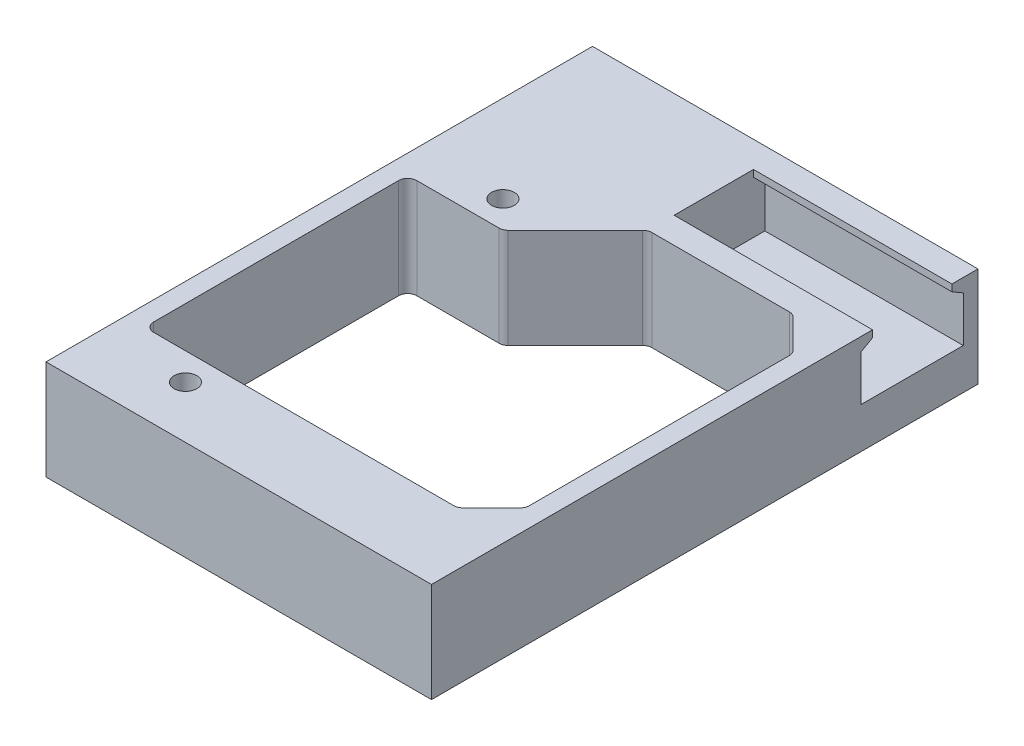
ISO-10303-21;
HEADER;
FILE_DESCRIPTION(('STEP AP214'),'2;1');
FILE_NAME('part.step','',(''),(''),'','','');
FILE_SCHEMA(('AUTOMOTIVE_DESIGN { 1 0 10303 214 1 1 1 1 }'));
ENDSEC;
DATA;
#1=APPLICATION_CONTEXT('core data for automotive mechanical design processes');
#2=APPLICATION_PROTOCOL_DEFINITION('international standard','automotive_design',2000,#1);
#3=PRODUCT_CONTEXT('',#1,'mechanical');
#4=PRODUCT('Part','Part','',(#3));
#5=PRODUCT_RELATED_PRODUCT_CATEGORY('part','',(#4));
#6=PRODUCT_DEFINITION_FORMATION('','',#4);
#7=PRODUCT_DEFINITION_CONTEXT('part definition',#1,'design');
#8=PRODUCT_DEFINITION('design','',#6,#7);
#9=PRODUCT_DEFINITION_SHAPE('','',#8);
#10=(LENGTH_UNIT() NAMED_UNIT(*) SI_UNIT(.MILLI.,.METRE.));
#11=(NAMED_UNIT(*) PLANE_ANGLE_UNIT() SI_UNIT($,.RADIAN.));
#12=(NAMED_UNIT(*) SI_UNIT($,.STERADIAN.) SOLID_ANGLE_UNIT());
#13=UNCERTAINTY_MEASURE_WITH_UNIT(LENGTH_MEASURE(1.E-05),#10,'distance_accuracy_value','');
#14=(GEOMETRIC_REPRESENTATION_CONTEXT(3) GLOBAL_UNCERTAINTY_ASSIGNED_CONTEXT((#13)) GLOBAL_UNIT_ASSIGNED_CONTEXT((#10,
#11,#12)) REPRESENTATION_CONTEXT('',''));
#15=CARTESIAN_POINT('',(0.,0.,0.));
#16=DIRECTION('',(0.,0.,1.));
#17=DIRECTION('',(1.,0.,0.));
#18=AXIS2_PLACEMENT_3D('',#15,#16,#17);
#19=CARTESIAN_POINT('',(12.3,-1.,8.5));
#20=DIRECTION('',(0.,-1.,0.));
#21=DIRECTION('',(1.,0.,0.));
#22=AXIS2_PLACEMENT_3D('',#19,#20,#21);
#23=PLANE('',#22);
#24=CARTESIAN_POINT('',(-14.,-1.,-54.3115384615385));
#25=DIRECTION('',(0.,1.,0.));
#26=DIRECTION('',(0.,0.,1.));
#27=AXIS2_PLACEMENT_3D('',#24,#25,#26);
#28=CIRCLE('',#27,1.);
#29=CARTESIAN_POINT('',(-14.,-1.,-53.3115384615385));
#30=VERTEX_POINT('',#29);
#31=EDGE_CURVE('E450',#30,#30,#28,.F.);
#32=ORIENTED_EDGE('',*,*,#31,.T.);
#33=EDGE_LOOP('',(#32));
#34=FACE_BOUND('',#33,.T.);
#35=CARTESIAN_POINT('',(-14.,-1.,-26.3115384615385));
#36=DIRECTION('',(0.,1.,0.));
#37=DIRECTION('',(0.,0.,1.));
#38=AXIS2_PLACEMENT_3D('',#35,#36,#37);
#39=CIRCLE('',#38,1.);
#40=CARTESIAN_POINT('',(-14.,-1.,-25.3115384615385));
#41=VERTEX_POINT('',#40);
#42=EDGE_CURVE('E497',#41,#41,#39,.F.);
#43=ORIENTED_EDGE('',*,*,#42,.T.);
#44=EDGE_LOOP('',(#43));
#45=FACE_BOUND('',#44,.T.);
#46=DIRECTION('',(-1.,0.,0.));
#47=VECTOR('',#46,1.);
#48=CARTESIAN_POINT('',(-21.7,-1.,-51.9115384615385));
#49=LINE('',#48,#47);
#50=CARTESIAN_POINT('',(-11.9313708498984,-1.,-51.9115384615385));
#51=VERTEX_POINT('',#50);
#52=CARTESIAN_POINT('',(-19.2,-1.,-51.9115384615385));
#53=VERTEX_POINT('',#52);
#54=EDGE_CURVE('E500',#51,#53,#49,.T.);
#55=ORIENTED_EDGE('',*,*,#54,.F.);
#56=CARTESIAN_POINT('',(-11.9313708498984,-1.,-52.7115384615385));
#57=DIRECTION('',(0.,-1.,0.));
#58=DIRECTION('',(1.,0.,0.));
#59=AXIS2_PLACEMENT_3D('',#56,#57,#58);
#60=CIRCLE('',#59,0.8);
#61=CARTESIAN_POINT('',(-11.3656854249492,-1.,-52.1458530365892));
#62=VERTEX_POINT('',#61);
#63=EDGE_CURVE('E405',#51,#62,#60,.F.);
#64=ORIENTED_EDGE('',*,*,#63,.T.);
#65=DIRECTION('',(-0.707106781186545,0.,0.70710678118655));
#66=VECTOR('',#65,1.);
#67=CARTESIAN_POINT('',(-29.8557692307693,-1.00000000000001,-33.655769230769));
#68=LINE('',#67,#66);
#69=CARTESIAN_POINT('',(-5.43431457505077,-1.,-58.0772238864877));
#70=VERTEX_POINT('',#69);
#71=EDGE_CURVE('E364',#62,#70,#68,.F.);
#72=ORIENTED_EDGE('',*,*,#71,.T.);
#73=CARTESIAN_POINT('',(-4.86862915010152,-1.,-57.5115384615385));
#74=DIRECTION('',(0.,-1.,0.));
#75=DIRECTION('',(1.,0.,0.));
#76=AXIS2_PLACEMENT_3D('',#73,#74,#75);
#77=CIRCLE('',#76,0.8);
#78=CARTESIAN_POINT('',(-4.86862915010152,-1.,-58.3115384615385));
#79=VERTEX_POINT('',#78);
#80=EDGE_CURVE('E13',#70,#79,#77,.T.);
#81=ORIENTED_EDGE('',*,*,#80,.T.);
#82=DIRECTION('',(-1.,0.,0.));
#83=VECTOR('',#82,1.);
#84=CARTESIAN_POINT('',(12.,-1.,-58.3115384615385));
#85=LINE('',#84,#83);
#86=CARTESIAN_POINT('',(7.26862915010155,-1.,-58.3115384615385));
#87=VERTEX_POINT('',#86);
#88=EDGE_CURVE('E449',#87,#79,#85,.T.);
#89=ORIENTED_EDGE('',*,*,#88,.F.);
#90=CARTESIAN_POINT('',(7.26862915010155,-1.,-57.5115384615385));
#91=DIRECTION('',(0.,-1.,0.));
#92=DIRECTION('',(1.,0.,0.));
#93=AXIS2_PLACEMENT_3D('',#90,#91,#92);
#94=CIRCLE('',#93,0.8);
#95=CARTESIAN_POINT('',(7.83431457505078,-1.,-58.0772238864877));
#96=VERTEX_POINT('',#95);
#97=EDGE_CURVE('E432',#87,#96,#94,.T.);
#98=ORIENTED_EDGE('',*,*,#97,.T.);
#99=DIRECTION('',(-0.707106781186544,0.,-0.707106781186551));
#100=VECTOR('',#99,1.);
#101=CARTESIAN_POINT('',(43.3557692307692,-0.999999999999996,-22.5557692307689));
#102=LINE('',#101,#100);
#103=CARTESIAN_POINT('',(10.3656854249492,-1.,-55.5458530365892));
#104=VERTEX_POINT('',#103);
#105=EDGE_CURVE('E361',#96,#104,#102,.F.);
#106=ORIENTED_EDGE('',*,*,#105,.T.);
#107=CARTESIAN_POINT('',(9.8,-1.,-54.98016761164));
#108=DIRECTION('',(0.,-1.,0.));
#109=DIRECTION('',(1.,0.,0.));
#110=AXIS2_PLACEMENT_3D('',#107,#108,#109);
#111=CIRCLE('',#110,0.8);
#112=CARTESIAN_POINT('',(10.6,-1.,-54.98016761164));
#113=VERTEX_POINT('',#112);
#114=EDGE_CURVE('E430',#104,#113,#111,.T.);
#115=ORIENTED_EDGE('',*,*,#114,.T.);
#116=DIRECTION('',(0.,0.,1.));
#117=VECTOR('',#116,1.);
#118=CARTESIAN_POINT('',(10.6,-1.,-28.7115384615385));
#119=LINE('',#118,#117);
#120=CARTESIAN_POINT('',(10.6,-1.,-32.042909311437));
#121=VERTEX_POINT('',#120);
#122=EDGE_CURVE('E465',#113,#121,#119,.T.);
#123=ORIENTED_EDGE('',*,*,#122,.T.);
#124=CARTESIAN_POINT('',(9.8,-1.,-32.042909311437));
#125=DIRECTION('',(0.,-1.,0.));
#126=DIRECTION('',(1.,0.,0.));
#127=AXIS2_PLACEMENT_3D('',#124,#125,#126);
#128=CIRCLE('',#127,0.8);
#129=CARTESIAN_POINT('',(10.3656854249492,-1.,-31.4772238864877));
#130=VERTEX_POINT('',#129);
#131=EDGE_CURVE('E424',#121,#130,#128,.T.);
#132=ORIENTED_EDGE('',*,*,#131,.T.);
#133=DIRECTION('',(0.707106781186543,0.,-0.707106781186552));
#134=VECTOR('',#133,1.);
#135=CARTESIAN_POINT('',(-8.65576923076926,-1.,-12.455769230769));
#136=LINE('',#135,#134);
#137=CARTESIAN_POINT('',(7.83431457505077,-1.,-28.9458530365892));
#138=VERTEX_POINT('',#137);
#139=EDGE_CURVE('E352',#130,#138,#136,.F.);
#140=ORIENTED_EDGE('',*,*,#139,.T.);
#141=CARTESIAN_POINT('',(7.26862915010153,-1.,-29.5115384615385));
#142=DIRECTION('',(0.,-1.,0.));
#143=DIRECTION('',(1.,0.,0.));
#144=AXIS2_PLACEMENT_3D('',#141,#142,#143);
#145=CIRCLE('',#144,0.8);
#146=CARTESIAN_POINT('',(7.26862915010153,-1.,-28.7115384615385));
#147=VERTEX_POINT('',#146);
#148=EDGE_CURVE('E422',#138,#147,#145,.T.);
#149=ORIENTED_EDGE('',*,*,#148,.T.);
#150=DIRECTION('',(1.,0.,0.));
#151=VECTOR('',#150,1.);
#152=CARTESIAN_POINT('',(-21.7,-1.,-28.7115384615385));
#153=LINE('',#152,#151);
#154=CARTESIAN_POINT('',(-19.2,-1.,-28.7115384615385));
#155=VERTEX_POINT('',#154);
#156=EDGE_CURVE('E306',#155,#147,#153,.T.);
#157=ORIENTED_EDGE('',*,*,#156,.F.);
#158=CARTESIAN_POINT('',(-19.2,-1.,-29.5115384615385));
#159=DIRECTION('',(0.,-1.,0.));
#160=DIRECTION('',(1.,0.,0.));
#161=AXIS2_PLACEMENT_3D('',#158,#159,#160);
#162=CIRCLE('',#161,0.8);
#163=CARTESIAN_POINT('',(-20.,-1.,-29.5115384615385));
#164=VERTEX_POINT('',#163);
#165=EDGE_CURVE('E418',#155,#164,#162,.T.);
#166=ORIENTED_EDGE('',*,*,#165,.T.);
#167=DIRECTION('',(0.,0.,1.));
#168=VECTOR('',#167,1.);
#169=CARTESIAN_POINT('',(-20.,-1.,0.));
#170=LINE('',#169,#168);
#171=CARTESIAN_POINT('',(-20.,-1.,-51.1115384615385));
#172=VERTEX_POINT('',#171);
#173=EDGE_CURVE('E508',#172,#164,#170,.T.);
#174=ORIENTED_EDGE('',*,*,#173,.F.);
#175=CARTESIAN_POINT('',(-19.2,-1.,-51.1115384615385));
#176=DIRECTION('',(0.,-1.,0.));
#177=DIRECTION('',(1.,0.,0.));
#178=AXIS2_PLACEMENT_3D('',#175,#176,#177);
#179=CIRCLE('',#178,0.8);
#180=EDGE_CURVE('E412',#172,#53,#179,.T.);
#181=ORIENTED_EDGE('',*,*,#180,.T.);
#182=EDGE_LOOP('',(#55,#64,#72,#81,#89,#98,#106,#115,#123,#132,#140,#149,#157,#166,#174,#181));
#183=FACE_BOUND('',#182,.T.);
#184=DIRECTION('',(0.,0.,-1.));
#185=VECTOR('',#184,1.);
#186=CARTESIAN_POINT('',(-21.7,-1.,8.5));
#187=LINE('',#186,#185);
#188=CARTESIAN_POINT('',(-21.7,-1.,-21.7115384615385));
#189=VERTEX_POINT('',#188);
#190=CARTESIAN_POINT('',(-21.7,-1.,-69.9115384615385));
#191=VERTEX_POINT('',#190);
#192=EDGE_CURVE('E313',#189,#191,#187,.T.);
#193=ORIENTED_EDGE('',*,*,#192,.F.);
#194=DIRECTION('',(-1.,0.,0.));
#195=VECTOR('',#194,1.);
#196=CARTESIAN_POINT('',(-21.7,-1.,-21.7115384615385));
#197=LINE('',#196,#195);
#198=CARTESIAN_POINT('',(12.3,-1.,-21.7115384615385));
#199=VERTEX_POINT('',#198);
#200=EDGE_CURVE('E296',#199,#189,#197,.T.);
#201=ORIENTED_EDGE('',*,*,#200,.F.);
#202=DIRECTION('',(0.,0.,-1.));
#203=VECTOR('',#202,1.);
#204=CARTESIAN_POINT('',(12.3,-1.,-21.7115384615385));
#205=LINE('',#204,#203);
#206=CARTESIAN_POINT('',(12.3,-1.,-60.6115384615385));
#207=VERTEX_POINT('',#206);
#208=EDGE_CURVE('E307',#199,#207,#205,.T.);
#209=ORIENTED_EDGE('',*,*,#208,.T.);
#210=DIRECTION('',(1.,0.,0.));
#211=VECTOR('',#210,1.);
#212=CARTESIAN_POINT('',(-5.20000000000001,-1.,-60.6115384615385));
#213=LINE('',#212,#211);
#214=CARTESIAN_POINT('',(-5.20000000000001,-1.,-60.6115384615385));
#215=VERTEX_POINT('',#214);
#216=EDGE_CURVE('E472',#215,#207,#213,.T.);
#217=ORIENTED_EDGE('',*,*,#216,.F.);
#218=DIRECTION('',(0.,0.,1.));
#219=VECTOR('',#218,1.);
#220=CARTESIAN_POINT('',(-5.20000000000001,-1.,0.));
#221=LINE('',#220,#219);
#222=CARTESIAN_POINT('',(-5.20000000000001,-1.,-67.6115384615385));
#223=VERTEX_POINT('',#222);
#224=EDGE_CURVE('E544',#223,#215,#221,.T.);
#225=ORIENTED_EDGE('',*,*,#224,.F.);
#226=DIRECTION('',(1.,0.,0.));
#227=VECTOR('',#226,1.);
#228=CARTESIAN_POINT('',(-5.20000000000001,-1.,-67.6115384615385));
#229=LINE('',#228,#227);
#230=CARTESIAN_POINT('',(12.3,-1.,-67.6115384615385));
#231=VERTEX_POINT('',#230);
#232=EDGE_CURVE('E478',#223,#231,#229,.T.);
#233=ORIENTED_EDGE('',*,*,#232,.T.);
#234=CARTESIAN_POINT('',(12.3,-1.,-69.9115384615385));
#235=VERTEX_POINT('',#234);
#236=EDGE_CURVE('E495',#231,#235,#205,.T.);
#237=ORIENTED_EDGE('',*,*,#236,.T.);
#238=DIRECTION('',(-1.,0.,0.));
#239=VECTOR('',#238,1.);
#240=CARTESIAN_POINT('',(0.,-1.,-69.9115384615385));
#241=LINE('',#240,#239);
#242=EDGE_CURVE('E319',#235,#191,#241,.T.);
#243=ORIENTED_EDGE('',*,*,#242,.T.);
#244=EDGE_LOOP('',(#193,#201,#209,#217,#225,#233,#237,#243));
#245=FACE_BOUND('',#244,.T.);
#246=ADVANCED_FACE('F113',(#34,#45,#183,#245),#23,.F.);
#247=CARTESIAN_POINT('',(12.3,-1.,8.5));
#248=DIRECTION('',(-1.,0.,0.));
#249=DIRECTION('',(0.,-1.,0.));
#250=AXIS2_PLACEMENT_3D('',#247,#248,#249);
#251=PLANE('',#250);
#252=ORIENTED_EDGE('',*,*,#208,.F.);
#253=DIRECTION('',(0.,-1.,0.));
#254=VECTOR('',#253,1.);
#255=CARTESIAN_POINT('',(12.3,-1.,-21.7115384615385));
#256=LINE('',#255,#254);
#257=CARTESIAN_POINT('',(12.3,-9.8,-21.7115384615385));
#258=VERTEX_POINT('',#257);
#259=EDGE_CURVE('E302',#199,#258,#256,.T.);
#260=ORIENTED_EDGE('',*,*,#259,.T.);
#261=DIRECTION('',(0.,0.,1.));
#262=VECTOR('',#261,1.);
#263=CARTESIAN_POINT('',(12.3,-9.8,-21.7115384615385));
#264=LINE('',#263,#262);
#265=CARTESIAN_POINT('',(12.3,-9.8,-69.9115384615385));
#266=VERTEX_POINT('',#265);
#267=EDGE_CURVE('E322',#266,#258,#264,.T.);
#268=ORIENTED_EDGE('',*,*,#267,.F.);
#269=DIRECTION('',(0.,1.,0.));
#270=VECTOR('',#269,1.);
#271=CARTESIAN_POINT('',(12.3,-51.0350578998017,-69.9115384615385));
#272=LINE('',#271,#270);
#273=EDGE_CURVE('E471',#266,#235,#272,.T.);
#274=ORIENTED_EDGE('',*,*,#273,.T.);
#275=ORIENTED_EDGE('',*,*,#236,.F.);
#276=DIRECTION('',(0.,-1.,0.));
#277=VECTOR('',#276,1.);
#278=CARTESIAN_POINT('',(12.3,0.,-67.6115384615385));
#279=LINE('',#278,#277);
#280=CARTESIAN_POINT('',(12.3,-1.59999999999999,-67.6115384615385));
#281=VERTEX_POINT('',#280);
#282=EDGE_CURVE('E533',#231,#281,#279,.T.);
#283=ORIENTED_EDGE('',*,*,#282,.T.);
#284=DIRECTION('',(0.,0.499999999999999,0.866025403784439));
#285=VECTOR('',#284,1.);
#286=CARTESIAN_POINT('',(12.3,-1.59999999999999,-67.6115384615385));
#287=LINE('',#286,#285);
#288=CARTESIAN_POINT('',(12.3,-2.17735026918962,-68.6115384615385));
#289=VERTEX_POINT('',#288);
#290=EDGE_CURVE('E335',#281,#289,#287,.F.);
#291=ORIENTED_EDGE('',*,*,#290,.T.);
#292=DIRECTION('',(0.,-1.,0.));
#293=VECTOR('',#292,1.);
#294=CARTESIAN_POINT('',(12.3,-2.38044092984233E-13,-68.6115384615385));
#295=LINE('',#294,#293);
#296=CARTESIAN_POINT('',(12.3,-6.2,-68.6115384615384));
#297=VERTEX_POINT('',#296);
#298=EDGE_CURVE('E553',#289,#297,#295,.T.);
#299=ORIENTED_EDGE('',*,*,#298,.T.);
#300=DIRECTION('',(0.,0.,-1.));
#301=VECTOR('',#300,1.);
#302=CARTESIAN_POINT('',(12.3,-6.2,0.));
#303=LINE('',#302,#301);
#304=CARTESIAN_POINT('',(12.3,-6.2,-59.6115384615385));
#305=VERTEX_POINT('',#304);
#306=EDGE_CURVE('E550',#305,#297,#303,.T.);
#307=ORIENTED_EDGE('',*,*,#306,.F.);
#308=DIRECTION('',(0.,-1.,0.));
#309=VECTOR('',#308,1.);
#310=CARTESIAN_POINT('',(12.3,0.,-59.6115384615385));
#311=LINE('',#310,#309);
#312=CARTESIAN_POINT('',(12.3,-2.17735026918961,-59.6115384615385));
#313=VERTEX_POINT('',#312);
#314=EDGE_CURVE('E527',#313,#305,#311,.T.);
#315=ORIENTED_EDGE('',*,*,#314,.F.);
#316=DIRECTION('',(0.,0.499999999999997,-0.866025403784441));
#317=VECTOR('',#316,1.);
#318=CARTESIAN_POINT('',(12.3,-2.2,-59.5723079769971));
#319=LINE('',#318,#317);
#320=CARTESIAN_POINT('',(12.3,-1.59999999999999,-60.6115384615385));
#321=VERTEX_POINT('',#320);
#322=EDGE_CURVE('E333',#313,#321,#319,.T.);
#323=ORIENTED_EDGE('',*,*,#322,.T.);
#324=DIRECTION('',(0.,1.,0.));
#325=VECTOR('',#324,1.);
#326=CARTESIAN_POINT('',(12.3,0.,-60.6115384615385));
#327=LINE('',#326,#325);
#328=EDGE_CURVE('E525',#321,#207,#327,.T.);
#329=ORIENTED_EDGE('',*,*,#328,.T.);
#330=EDGE_LOOP('',(#252,#260,#268,#274,#275,#283,#291,#299,#307,#315,#323,#329));
#331=FACE_BOUND('',#330,.T.);
#332=ADVANCED_FACE('F523',(#331),#251,.F.);
#333=CARTESIAN_POINT('',(-21.7,-1.,8.5));
#334=DIRECTION('',(1.,0.,0.));
#335=DIRECTION('',(0.,1.,0.));
#336=AXIS2_PLACEMENT_3D('',#333,#334,#335);
#337=PLANE('',#336);
#338=DIRECTION('',(0.,0.,1.));
#339=VECTOR('',#338,1.);
#340=CARTESIAN_POINT('',(-21.7,-9.8,0.));
#341=LINE('',#340,#339);
#342=CARTESIAN_POINT('',(-21.7,-9.8,-69.9115384615385));
#343=VERTEX_POINT('',#342);
#344=CARTESIAN_POINT('',(-21.7,-9.8,-21.7115384615385));
#345=VERTEX_POINT('',#344);
#346=EDGE_CURVE('E316',#343,#345,#341,.T.);
#347=ORIENTED_EDGE('',*,*,#346,.T.);
#348=DIRECTION('',(0.,1.,0.));
#349=VECTOR('',#348,1.);
#350=CARTESIAN_POINT('',(-21.7,-39.,-21.7115384615385));
#351=LINE('',#350,#349);
#352=EDGE_CURVE('E299',#345,#189,#351,.T.);
#353=ORIENTED_EDGE('',*,*,#352,.T.);
#354=ORIENTED_EDGE('',*,*,#192,.T.);
#355=DIRECTION('',(0.,1.,0.));
#356=VECTOR('',#355,1.);
#357=CARTESIAN_POINT('',(-21.7,-9.8,-69.9115384615385));
#358=LINE('',#357,#356);
#359=EDGE_CURVE('E327',#343,#191,#358,.T.);
#360=ORIENTED_EDGE('',*,*,#359,.F.);
#361=EDGE_LOOP('',(#347,#353,#354,#360));
#362=FACE_BOUND('',#361,.T.);
#363=ADVANCED_FACE('F311',(#362),#337,.F.);
#364=CARTESIAN_POINT('',(-21.7,15.6524758424985,-21.7115384615385));
#365=DIRECTION('',(0.,0.,1.));
#366=DIRECTION('',(1.,0.,0.));
#367=AXIS2_PLACEMENT_3D('',#364,#365,#366);
#368=PLANE('',#367);
#369=DIRECTION('',(-1.,0.,0.));
#370=VECTOR('',#369,1.);
#371=CARTESIAN_POINT('',(-18.7,-9.8,-21.7115384615385));
#372=LINE('',#371,#370);
#373=EDGE_CURVE('E321',#258,#345,#372,.T.);
#374=ORIENTED_EDGE('',*,*,#373,.F.);
#375=ORIENTED_EDGE('',*,*,#259,.F.);
#376=ORIENTED_EDGE('',*,*,#200,.T.);
#377=ORIENTED_EDGE('',*,*,#352,.F.);
#378=EDGE_LOOP('',(#374,#375,#376,#377));
#379=FACE_BOUND('',#378,.T.);
#380=ADVANCED_FACE('F298',(#379),#368,.T.);
#381=CARTESIAN_POINT('',(-20.,-9.8,0.));
#382=DIRECTION('',(-1.,0.,0.));
#383=DIRECTION('',(0.,0.,1.));
#384=AXIS2_PLACEMENT_3D('',#381,#382,#383);
#385=PLANE('',#384);
#386=DIRECTION('',(0.,0.,1.));
#387=VECTOR('',#386,1.);
#388=CARTESIAN_POINT('',(-20.,-9.8,0.));
#389=LINE('',#388,#387);
#390=CARTESIAN_POINT('',(-20.,-9.8,-51.1115384615385));
#391=VERTEX_POINT('',#390);
#392=CARTESIAN_POINT('',(-20.,-9.8,-29.5115384615385));
#393=VERTEX_POINT('',#392);
#394=EDGE_CURVE('E509',#391,#393,#389,.T.);
#395=ORIENTED_EDGE('',*,*,#394,.F.);
#396=DIRECTION('',(0.,1.,0.));
#397=VECTOR('',#396,1.);
#398=CARTESIAN_POINT('',(-20.,-9.8,-51.1115384615385));
#399=LINE('',#398,#397);
#400=EDGE_CURVE('E372',#391,#172,#399,.T.);
#401=ORIENTED_EDGE('',*,*,#400,.T.);
#402=ORIENTED_EDGE('',*,*,#173,.T.);
#403=DIRECTION('',(0.,-1.,0.));
#404=VECTOR('',#403,1.);
#405=CARTESIAN_POINT('',(-20.,-9.8,-29.5115384615385));
#406=LINE('',#405,#404);
#407=EDGE_CURVE('E369',#164,#393,#406,.T.);
#408=ORIENTED_EDGE('',*,*,#407,.T.);
#409=EDGE_LOOP('',(#395,#401,#402,#408));
#410=FACE_BOUND('',#409,.T.);
#411=ADVANCED_FACE('F613',(#410),#385,.F.);
#412=CARTESIAN_POINT('',(0.,-9.8,-69.9115384615385));
#413=DIRECTION('',(0.,0.,-1.));
#414=DIRECTION('',(-1.,0.,0.));
#415=AXIS2_PLACEMENT_3D('',#412,#413,#414);
#416=PLANE('',#415);
#417=ORIENTED_EDGE('',*,*,#359,.T.);
#418=ORIENTED_EDGE('',*,*,#242,.F.);
#419=ORIENTED_EDGE('',*,*,#273,.F.);
#420=DIRECTION('',(-1.,0.,0.));
#421=VECTOR('',#420,1.);
#422=CARTESIAN_POINT('',(0.,-9.8,-69.9115384615385));
#423=LINE('',#422,#421);
#424=EDGE_CURVE('E512',#266,#343,#423,.T.);
#425=ORIENTED_EDGE('',*,*,#424,.T.);
#426=EDGE_LOOP('',(#417,#418,#419,#425));
#427=FACE_BOUND('',#426,.T.);
#428=ADVANCED_FACE('F518',(#427),#416,.T.);
#429=CARTESIAN_POINT('',(0.,-9.8,0.));
#430=DIRECTION('',(0.,1.,0.));
#431=DIRECTION('',(0.,0.,1.));
#432=AXIS2_PLACEMENT_3D('',#429,#430,#431);
#433=PLANE('',#432);
#434=DIRECTION('',(0.707106781186545,0.,-0.70710678118655));
#435=VECTOR('',#434,1.);
#436=CARTESIAN_POINT('',(-31.7557692307692,-9.8,-31.755769230769));
#437=LINE('',#436,#435);
#438=CARTESIAN_POINT('',(-5.43431457505076,-9.8,-58.0772238864877));
#439=VERTEX_POINT('',#438);
#440=CARTESIAN_POINT('',(-11.3656854249492,-9.8,-52.1458530365892));
#441=VERTEX_POINT('',#440);
#442=EDGE_CURVE('E367',#439,#441,#437,.F.);
#443=ORIENTED_EDGE('',*,*,#442,.T.);
#444=CARTESIAN_POINT('',(-11.9313708498984,-9.8,-52.7115384615385));
#445=DIRECTION('',(0.,1.,0.));
#446=DIRECTION('',(0.,0.,1.));
#447=AXIS2_PLACEMENT_3D('',#444,#445,#446);
#448=CIRCLE('',#447,0.8);
#449=CARTESIAN_POINT('',(-11.9313708498984,-9.8,-51.9115384615385));
#450=VERTEX_POINT('',#449);
#451=EDGE_CURVE('E410',#441,#450,#448,.F.);
#452=ORIENTED_EDGE('',*,*,#451,.T.);
#453=DIRECTION('',(-1.,0.,0.));
#454=VECTOR('',#453,1.);
#455=CARTESIAN_POINT('',(-21.7,-9.8,-51.9115384615385));
#456=LINE('',#455,#454);
#457=CARTESIAN_POINT('',(-19.2,-9.8,-51.9115384615385));
#458=VERTEX_POINT('',#457);
#459=EDGE_CURVE('E492',#450,#458,#456,.T.);
#460=ORIENTED_EDGE('',*,*,#459,.T.);
#461=CARTESIAN_POINT('',(-19.2,-9.8,-51.1115384615385));
#462=DIRECTION('',(0.,1.,0.));
#463=DIRECTION('',(0.,0.,1.));
#464=AXIS2_PLACEMENT_3D('',#461,#462,#463);
#465=CIRCLE('',#464,0.8);
#466=EDGE_CURVE('E414',#458,#391,#465,.T.);
#467=ORIENTED_EDGE('',*,*,#466,.T.);
#468=ORIENTED_EDGE('',*,*,#394,.T.);
#469=CARTESIAN_POINT('',(-19.2,-9.8,-29.5115384615385));
#470=DIRECTION('',(0.,1.,0.));
#471=DIRECTION('',(0.,0.,1.));
#472=AXIS2_PLACEMENT_3D('',#469,#470,#471);
#473=CIRCLE('',#472,0.8);
#474=CARTESIAN_POINT('',(-19.2,-9.8,-28.7115384615385));
#475=VERTEX_POINT('',#474);
#476=EDGE_CURVE('E416',#393,#475,#473,.T.);
#477=ORIENTED_EDGE('',*,*,#476,.T.);
#478=DIRECTION('',(1.,0.,0.));
#479=VECTOR('',#478,1.);
#480=CARTESIAN_POINT('',(-21.7,-9.8,-28.7115384615385));
#481=LINE('',#480,#479);
#482=CARTESIAN_POINT('',(7.26862915010153,-9.8,-28.7115384615385));
#483=VERTEX_POINT('',#482);
#484=EDGE_CURVE('E483',#475,#483,#481,.T.);
#485=ORIENTED_EDGE('',*,*,#484,.T.);
#486=CARTESIAN_POINT('',(7.26862915010153,-9.8,-29.5115384615385));
#487=DIRECTION('',(0.,1.,0.));
#488=DIRECTION('',(0.,0.,1.));
#489=AXIS2_PLACEMENT_3D('',#486,#487,#488);
#490=CIRCLE('',#489,0.8);
#491=CARTESIAN_POINT('',(7.83431457505078,-9.8,-28.9458530365892));
#492=VERTEX_POINT('',#491);
#493=EDGE_CURVE('E420',#483,#492,#490,.T.);
#494=ORIENTED_EDGE('',*,*,#493,.T.);
#495=DIRECTION('',(-0.707106781186543,0.,0.707106781186552));
#496=VECTOR('',#495,1.);
#497=CARTESIAN_POINT('',(-10.5557692307692,-9.8,-10.555769230769));
#498=LINE('',#497,#496);
#499=CARTESIAN_POINT('',(10.3656854249492,-9.8,-31.4772238864877));
#500=VERTEX_POINT('',#499);
#501=EDGE_CURVE('E355',#492,#500,#498,.F.);
#502=ORIENTED_EDGE('',*,*,#501,.T.);
#503=CARTESIAN_POINT('',(9.8,-9.8,-32.042909311437));
#504=DIRECTION('',(0.,1.,0.));
#505=DIRECTION('',(0.,0.,1.));
#506=AXIS2_PLACEMENT_3D('',#503,#504,#505);
#507=CIRCLE('',#506,0.8);
#508=CARTESIAN_POINT('',(10.6,-9.8,-32.042909311437));
#509=VERTEX_POINT('',#508);
#510=EDGE_CURVE('E426',#500,#509,#507,.T.);
#511=ORIENTED_EDGE('',*,*,#510,.T.);
#512=DIRECTION('',(0.,0.,-1.));
#513=VECTOR('',#512,1.);
#514=CARTESIAN_POINT('',(10.6,-9.8,-28.7115384615385));
#515=LINE('',#514,#513);
#516=CARTESIAN_POINT('',(10.6,-9.8,-54.98016761164));
#517=VERTEX_POINT('',#516);
#518=EDGE_CURVE('E475',#509,#517,#515,.T.);
#519=ORIENTED_EDGE('',*,*,#518,.T.);
#520=CARTESIAN_POINT('',(9.8,-9.8,-54.98016761164));
#521=DIRECTION('',(0.,1.,0.));
#522=DIRECTION('',(0.,0.,1.));
#523=AXIS2_PLACEMENT_3D('',#520,#521,#522);
#524=CIRCLE('',#523,0.8);
#525=CARTESIAN_POINT('',(10.3656854249492,-9.8,-55.5458530365892));
#526=VERTEX_POINT('',#525);
#527=EDGE_CURVE('E428',#517,#526,#524,.T.);
#528=ORIENTED_EDGE('',*,*,#527,.T.);
#529=DIRECTION('',(0.707106781186544,0.,0.707106781186551));
#530=VECTOR('',#529,1.);
#531=CARTESIAN_POINT('',(32.9557692307693,-9.8,-32.955769230769));
#532=LINE('',#531,#530);
#533=CARTESIAN_POINT('',(7.83431457505079,-9.8,-58.0772238864877));
#534=VERTEX_POINT('',#533);
#535=EDGE_CURVE('E358',#526,#534,#532,.F.);
#536=ORIENTED_EDGE('',*,*,#535,.T.);
#537=CARTESIAN_POINT('',(7.26862915010155,-9.8,-57.5115384615385));
#538=DIRECTION('',(0.,1.,0.));
#539=DIRECTION('',(0.,0.,1.));
#540=AXIS2_PLACEMENT_3D('',#537,#538,#539);
#541=CIRCLE('',#540,0.8);
#542=CARTESIAN_POINT('',(7.26862915010155,-9.8,-58.3115384615385));
#543=VERTEX_POINT('',#542);
#544=EDGE_CURVE('E434',#534,#543,#541,.T.);
#545=ORIENTED_EDGE('',*,*,#544,.T.);
#546=DIRECTION('',(-1.,0.,0.));
#547=VECTOR('',#546,1.);
#548=CARTESIAN_POINT('',(12.,-9.8,-58.3115384615385));
#549=LINE('',#548,#547);
#550=CARTESIAN_POINT('',(-4.86862915010152,-9.8,-58.3115384615385));
#551=VERTEX_POINT('',#550);
#552=EDGE_CURVE('E439',#543,#551,#549,.T.);
#553=ORIENTED_EDGE('',*,*,#552,.T.);
#554=CARTESIAN_POINT('',(-4.86862915010152,-9.8,-57.5115384615385));
#555=DIRECTION('',(0.,1.,0.));
#556=DIRECTION('',(0.,0.,1.));
#557=AXIS2_PLACEMENT_3D('',#554,#555,#556);
#558=CIRCLE('',#557,0.8);
#559=EDGE_CURVE('E121',#551,#439,#558,.T.);
#560=ORIENTED_EDGE('',*,*,#559,.T.);
#561=EDGE_LOOP('',(#443,#452,#460,#467,#468,#477,#485,#494,#502,#511,#519,#528,#536,#545,#553,#560));
#562=FACE_BOUND('',#561,.T.);
#563=ORIENTED_EDGE('',*,*,#346,.F.);
#564=ORIENTED_EDGE('',*,*,#424,.F.);
#565=ORIENTED_EDGE('',*,*,#267,.T.);
#566=ORIENTED_EDGE('',*,*,#373,.T.);
#567=EDGE_LOOP('',(#563,#564,#565,#566));
#568=FACE_BOUND('',#567,.T.);
#569=CARTESIAN_POINT('',(-14.,-9.8,-54.3115384615385));
#570=DIRECTION('',(0.,1.,0.));
#571=DIRECTION('',(-1.,0.,0.));
#572=AXIS2_PLACEMENT_3D('',#569,#570,#571);
#573=CIRCLE('',#572,1.);
#574=CARTESIAN_POINT('',(-15.,-9.8,-54.3115384615385));
#575=VERTEX_POINT('',#574);
#576=EDGE_CURVE('E489',#575,#575,#573,.F.);
#577=ORIENTED_EDGE('',*,*,#576,.F.);
#578=EDGE_LOOP('',(#577));
#579=FACE_BOUND('',#578,.T.);
#580=CARTESIAN_POINT('',(-14.,-9.8,-26.3115384615385));
#581=DIRECTION('',(0.,1.,0.));
#582=DIRECTION('',(-1.,0.,0.));
#583=AXIS2_PLACEMENT_3D('',#580,#581,#582);
#584=CIRCLE('',#583,1.);
#585=CARTESIAN_POINT('',(-15.,-9.8,-26.3115384615385));
#586=VERTEX_POINT('',#585);
#587=EDGE_CURVE('E486',#586,#586,#584,.F.);
#588=ORIENTED_EDGE('',*,*,#587,.F.);
#589=EDGE_LOOP('',(#588));
#590=FACE_BOUND('',#589,.T.);
#591=ADVANCED_FACE('F437',(#562,#568,#579,#590),#433,.F.);
#592=CARTESIAN_POINT('',(12.,34.6405667743935,-58.3115384615385));
#593=DIRECTION('',(0.,0.,1.));
#594=DIRECTION('',(1.,0.,0.));
#595=AXIS2_PLACEMENT_3D('',#592,#593,#594);
#596=PLANE('',#595);
#597=ORIENTED_EDGE('',*,*,#552,.F.);
#598=DIRECTION('',(0.,-1.,0.));
#599=VECTOR('',#598,1.);
#600=CARTESIAN_POINT('',(7.26862915010155,34.6405667743935,-58.3115384615385));
#601=LINE('',#600,#599);
#602=EDGE_CURVE('E402',#543,#87,#601,.F.);
#603=ORIENTED_EDGE('',*,*,#602,.T.);
#604=ORIENTED_EDGE('',*,*,#88,.T.);
#605=DIRECTION('',(0.,1.,0.));
#606=VECTOR('',#605,1.);
#607=CARTESIAN_POINT('',(-4.86862915010152,34.6405667743935,-58.3115384615385));
#608=LINE('',#607,#606);
#609=EDGE_CURVE('E399',#79,#551,#608,.F.);
#610=ORIENTED_EDGE('',*,*,#609,.T.);
#611=EDGE_LOOP('',(#597,#603,#604,#610));
#612=FACE_BOUND('',#611,.T.);
#613=ADVANCED_FACE('F445',(#612),#596,.T.);
#614=CARTESIAN_POINT('',(-21.7,15.6524758424985,-51.9115384615385));
#615=DIRECTION('',(0.,0.,1.));
#616=DIRECTION('',(1.,0.,0.));
#617=AXIS2_PLACEMENT_3D('',#614,#615,#616);
#618=PLANE('',#617);
#619=ORIENTED_EDGE('',*,*,#54,.T.);
#620=DIRECTION('',(0.,1.,0.));
#621=VECTOR('',#620,1.);
#622=CARTESIAN_POINT('',(-19.2,15.6524758424985,-51.9115384615385));
#623=LINE('',#622,#621);
#624=EDGE_CURVE('E378',#53,#458,#623,.F.);
#625=ORIENTED_EDGE('',*,*,#624,.T.);
#626=ORIENTED_EDGE('',*,*,#459,.F.);
#627=DIRECTION('',(0.,-1.,0.));
#628=VECTOR('',#627,1.);
#629=CARTESIAN_POINT('',(-11.9313708498984,-1.,-51.9115384615385));
#630=LINE('',#629,#628);
#631=EDGE_CURVE('E375',#450,#51,#630,.F.);
#632=ORIENTED_EDGE('',*,*,#631,.T.);
#633=EDGE_LOOP('',(#619,#625,#626,#632));
#634=FACE_BOUND('',#633,.T.);
#635=ADVANCED_FACE('F623',(#634),#618,.T.);
#636=CARTESIAN_POINT('',(-14.,15.6524758424985,-54.3115384615385));
#637=DIRECTION('',(0.,-1.,0.));
#638=DIRECTION('',(0.,0.,-1.));
#639=AXIS2_PLACEMENT_3D('',#636,#637,#638);
#640=CYLINDRICAL_SURFACE('',#639,1.);
#641=ORIENTED_EDGE('',*,*,#576,.T.);
#642=EDGE_LOOP('',(#641));
#643=FACE_BOUND('',#642,.T.);
#644=ORIENTED_EDGE('',*,*,#31,.F.);
#645=EDGE_LOOP('',(#644));
#646=FACE_BOUND('',#645,.T.);
#647=ADVANCED_FACE('F624',(#643,#646),#640,.F.);
#648=CARTESIAN_POINT('',(-21.7,15.6524758424985,-28.7115384615385));
#649=DIRECTION('',(0.,0.,-1.));
#650=DIRECTION('',(-1.,0.,0.));
#651=AXIS2_PLACEMENT_3D('',#648,#649,#650);
#652=PLANE('',#651);
#653=ORIENTED_EDGE('',*,*,#484,.F.);
#654=DIRECTION('',(0.,-1.,0.));
#655=VECTOR('',#654,1.);
#656=CARTESIAN_POINT('',(-19.2,15.6524758424985,-28.7115384615385));
#657=LINE('',#656,#655);
#658=EDGE_CURVE('E383',#475,#155,#657,.F.);
#659=ORIENTED_EDGE('',*,*,#658,.T.);
#660=ORIENTED_EDGE('',*,*,#156,.T.);
#661=DIRECTION('',(0.,1.,0.));
#662=VECTOR('',#661,1.);
#663=CARTESIAN_POINT('',(7.26862915010153,15.6524758424985,-28.7115384615385));
#664=LINE('',#663,#662);
#665=EDGE_CURVE('E380',#147,#483,#664,.F.);
#666=ORIENTED_EDGE('',*,*,#665,.T.);
#667=EDGE_LOOP('',(#653,#659,#660,#666));
#668=FACE_BOUND('',#667,.T.);
#669=ADVANCED_FACE('F627',(#668),#652,.T.);
#670=CARTESIAN_POINT('',(-14.,15.6524758424985,-26.3115384615385));
#671=DIRECTION('',(0.,-1.,0.));
#672=DIRECTION('',(0.,0.,-1.));
#673=AXIS2_PLACEMENT_3D('',#670,#671,#672);
#674=CYLINDRICAL_SURFACE('',#673,1.);
#675=ORIENTED_EDGE('',*,*,#587,.T.);
#676=EDGE_LOOP('',(#675));
#677=FACE_BOUND('',#676,.T.);
#678=ORIENTED_EDGE('',*,*,#42,.F.);
#679=EDGE_LOOP('',(#678));
#680=FACE_BOUND('',#679,.T.);
#681=ADVANCED_FACE('F632',(#677,#680),#674,.F.);
#682=CARTESIAN_POINT('',(10.6,-51.0350578998017,-28.7115384615385));
#683=DIRECTION('',(-1.,0.,0.));
#684=DIRECTION('',(0.,0.,1.));
#685=AXIS2_PLACEMENT_3D('',#682,#683,#684);
#686=PLANE('',#685);
#687=ORIENTED_EDGE('',*,*,#518,.F.);
#688=DIRECTION('',(0.,-1.,0.));
#689=VECTOR('',#688,1.);
#690=CARTESIAN_POINT('',(10.6,-51.0350578998017,-32.042909311437));
#691=LINE('',#690,#689);
#692=EDGE_CURVE('E392',#509,#121,#691,.F.);
#693=ORIENTED_EDGE('',*,*,#692,.T.);
#694=ORIENTED_EDGE('',*,*,#122,.F.);
#695=DIRECTION('',(0.,1.,0.));
#696=VECTOR('',#695,1.);
#697=CARTESIAN_POINT('',(10.6,-51.0350578998017,-54.98016761164));
#698=LINE('',#697,#696);
#699=EDGE_CURVE('E389',#113,#517,#698,.F.);
#700=ORIENTED_EDGE('',*,*,#699,.T.);
#701=EDGE_LOOP('',(#687,#693,#694,#700));
#702=FACE_BOUND('',#701,.T.);
#703=ADVANCED_FACE('F468',(#702),#686,.T.);
#704=CARTESIAN_POINT('',(-5.20000000000001,0.,-60.6115384615385));
#705=DIRECTION('',(0.,0.,-1.));
#706=DIRECTION('',(-1.,0.,0.));
#707=AXIS2_PLACEMENT_3D('',#704,#705,#706);
#708=PLANE('',#707);
#709=ORIENTED_EDGE('',*,*,#328,.F.);
#710=DIRECTION('',(-1.,0.,0.));
#711=VECTOR('',#710,1.);
#712=CARTESIAN_POINT('',(-5.20000000000001,-1.59999999999999,-60.6115384615385));
#713=LINE('',#712,#711);
#714=CARTESIAN_POINT('',(-5.20000000000001,-1.59999999999999,-60.6115384615385));
#715=VERTEX_POINT('',#714);
#716=EDGE_CURVE('E338',#321,#715,#713,.T.);
#717=ORIENTED_EDGE('',*,*,#716,.T.);
#718=DIRECTION('',(0.,1.,0.));
#719=VECTOR('',#718,1.);
#720=CARTESIAN_POINT('',(-5.20000000000001,0.,-60.6115384615385));
#721=LINE('',#720,#719);
#722=EDGE_CURVE('E530',#715,#215,#721,.T.);
#723=ORIENTED_EDGE('',*,*,#722,.T.);
#724=ORIENTED_EDGE('',*,*,#216,.T.);
#725=EDGE_LOOP('',(#709,#717,#723,#724));
#726=FACE_BOUND('',#725,.T.);
#727=ADVANCED_FACE('F582',(#726),#708,.T.);
#728=CARTESIAN_POINT('',(-5.20000000000001,0.,-67.6115384615385));
#729=DIRECTION('',(0.,0.,1.));
#730=DIRECTION('',(1.,0.,0.));
#731=AXIS2_PLACEMENT_3D('',#728,#729,#730);
#732=PLANE('',#731);
#733=DIRECTION('',(0.,-1.,0.));
#734=VECTOR('',#733,1.);
#735=CARTESIAN_POINT('',(-5.20000000000001,0.,-67.6115384615385));
#736=LINE('',#735,#734);
#737=CARTESIAN_POINT('',(-5.20000000000001,-1.59999999999999,-67.6115384615385));
#738=VERTEX_POINT('',#737);
#739=EDGE_CURVE('E541',#223,#738,#736,.T.);
#740=ORIENTED_EDGE('',*,*,#739,.T.);
#741=DIRECTION('',(1.,0.,0.));
#742=VECTOR('',#741,1.);
#743=CARTESIAN_POINT('',(-5.20000000000001,-1.59999999999999,-67.6115384615385));
#744=LINE('',#743,#742);
#745=EDGE_CURVE('E324',#738,#281,#744,.T.);
#746=ORIENTED_EDGE('',*,*,#745,.T.);
#747=ORIENTED_EDGE('',*,*,#282,.F.);
#748=ORIENTED_EDGE('',*,*,#232,.F.);
#749=EDGE_LOOP('',(#740,#746,#747,#748));
#750=FACE_BOUND('',#749,.T.);
#751=ADVANCED_FACE('F589',(#750),#732,.T.);
#752=CARTESIAN_POINT('',(-5.20000000000001,-2.38044092984233E-13,-68.6115384615385));
#753=DIRECTION('',(0.,0.,1.));
#754=DIRECTION('',(0.,-1.,0.));
#755=AXIS2_PLACEMENT_3D('',#752,#753,#754);
#756=PLANE('',#755);
#757=ORIENTED_EDGE('',*,*,#298,.F.);
#758=DIRECTION('',(1.,0.,0.));
#759=VECTOR('',#758,1.);
#760=CARTESIAN_POINT('',(-5.20000000000001,-2.17735026918962,-68.6115384615385));
#761=LINE('',#760,#759);
#762=CARTESIAN_POINT('',(-5.20000000000001,-2.17735026918962,-68.6115384615385));
#763=VERTEX_POINT('',#762);
#764=EDGE_CURVE('E341',#289,#763,#761,.F.);
#765=ORIENTED_EDGE('',*,*,#764,.T.);
#766=DIRECTION('',(0.,-1.,0.));
#767=VECTOR('',#766,1.);
#768=CARTESIAN_POINT('',(-5.20000000000001,-2.38044092984233E-13,-68.6115384615385));
#769=LINE('',#768,#767);
#770=CARTESIAN_POINT('',(-5.20000000000001,-6.2,-68.6115384615384));
#771=VERTEX_POINT('',#770);
#772=EDGE_CURVE('E539',#763,#771,#769,.T.);
#773=ORIENTED_EDGE('',*,*,#772,.T.);
#774=DIRECTION('',(1.,0.,0.));
#775=VECTOR('',#774,1.);
#776=CARTESIAN_POINT('',(-5.20000000000001,-6.2,-68.6115384615384));
#777=LINE('',#776,#775);
#778=EDGE_CURVE('E560',#771,#297,#777,.T.);
#779=ORIENTED_EDGE('',*,*,#778,.T.);
#780=EDGE_LOOP('',(#757,#765,#773,#779));
#781=FACE_BOUND('',#780,.T.);
#782=ADVANCED_FACE('F572',(#781),#756,.T.);
#783=CARTESIAN_POINT('',(-5.20000000000001,-6.2,0.));
#784=DIRECTION('',(0.,-1.,0.));
#785=DIRECTION('',(0.,0.,-1.));
#786=AXIS2_PLACEMENT_3D('',#783,#784,#785);
#787=PLANE('',#786);
#788=ORIENTED_EDGE('',*,*,#306,.T.);
#789=ORIENTED_EDGE('',*,*,#778,.F.);
#790=DIRECTION('',(0.,0.,-1.));
#791=VECTOR('',#790,1.);
#792=CARTESIAN_POINT('',(-5.20000000000001,-6.2,0.));
#793=LINE('',#792,#791);
#794=CARTESIAN_POINT('',(-5.20000000000001,-6.2,-59.6115384615385));
#795=VERTEX_POINT('',#794);
#796=EDGE_CURVE('E536',#795,#771,#793,.T.);
#797=ORIENTED_EDGE('',*,*,#796,.F.);
#798=DIRECTION('',(1.,0.,0.));
#799=VECTOR('',#798,1.);
#800=CARTESIAN_POINT('',(-5.20000000000001,-6.2,-59.6115384615385));
#801=LINE('',#800,#799);
#802=EDGE_CURVE('E546',#795,#305,#801,.T.);
#803=ORIENTED_EDGE('',*,*,#802,.T.);
#804=EDGE_LOOP('',(#788,#789,#797,#803));
#805=FACE_BOUND('',#804,.T.);
#806=ADVANCED_FACE('F563',(#805),#787,.F.);
#807=CARTESIAN_POINT('',(-5.20000000000001,0.,-59.6115384615385));
#808=DIRECTION('',(0.,0.,1.));
#809=DIRECTION('',(1.,0.,0.));
#810=AXIS2_PLACEMENT_3D('',#807,#808,#809);
#811=PLANE('',#810);
#812=ORIENTED_EDGE('',*,*,#314,.T.);
#813=ORIENTED_EDGE('',*,*,#802,.F.);
#814=DIRECTION('',(0.,-1.,0.));
#815=VECTOR('',#814,1.);
#816=CARTESIAN_POINT('',(-5.20000000000001,0.,-59.6115384615385));
#817=LINE('',#816,#815);
#818=CARTESIAN_POINT('',(-5.20000000000001,-2.17735026918961,-59.6115384615385));
#819=VERTEX_POINT('',#818);
#820=EDGE_CURVE('E532',#819,#795,#817,.T.);
#821=ORIENTED_EDGE('',*,*,#820,.F.);
#822=DIRECTION('',(1.,0.,0.));
#823=VECTOR('',#822,1.);
#824=CARTESIAN_POINT('',(-5.20000000000001,-2.17735026918961,-59.6115384615385));
#825=LINE('',#824,#823);
#826=EDGE_CURVE('E346',#819,#313,#825,.T.);
#827=ORIENTED_EDGE('',*,*,#826,.T.);
#828=EDGE_LOOP('',(#812,#813,#821,#827));
#829=FACE_BOUND('',#828,.T.);
#830=ADVANCED_FACE('F567',(#829),#811,.F.);
#831=CARTESIAN_POINT('',(-5.20000000000001,0.,0.));
#832=DIRECTION('',(1.,0.,0.));
#833=DIRECTION('',(0.,0.,-1.));
#834=AXIS2_PLACEMENT_3D('',#831,#832,#833);
#835=PLANE('',#834);
#836=ORIENTED_EDGE('',*,*,#722,.F.);
#837=DIRECTION('',(0.,-0.499999999999997,0.866025403784441));
#838=VECTOR('',#837,1.);
#839=CARTESIAN_POINT('',(-5.20000000000001,-2.2,-59.5723079769971));
#840=LINE('',#839,#838);
#841=EDGE_CURVE('E349',#715,#819,#840,.T.);
#842=ORIENTED_EDGE('',*,*,#841,.T.);
#843=ORIENTED_EDGE('',*,*,#820,.T.);
#844=ORIENTED_EDGE('',*,*,#796,.T.);
#845=ORIENTED_EDGE('',*,*,#772,.F.);
#846=DIRECTION('',(0.,-0.499999999999999,-0.866025403784439));
#847=VECTOR('',#846,1.);
#848=CARTESIAN_POINT('',(-5.20000000000001,-1.59999999999999,-67.6115384615385));
#849=LINE('',#848,#847);
#850=EDGE_CURVE('E344',#763,#738,#849,.F.);
#851=ORIENTED_EDGE('',*,*,#850,.T.);
#852=ORIENTED_EDGE('',*,*,#739,.F.);
#853=ORIENTED_EDGE('',*,*,#224,.T.);
#854=EDGE_LOOP('',(#836,#842,#843,#844,#845,#851,#852,#853));
#855=FACE_BOUND('',#854,.T.);
#856=ADVANCED_FACE('F576',(#855),#835,.T.);
#857=CARTESIAN_POINT('',(-5.20000000000001,-1.59999999999999,-67.6115384615385));
#858=DIRECTION('',(0.,0.866025403784439,-0.499999999999999));
#859=DIRECTION('',(1.,0.,0.));
#860=AXIS2_PLACEMENT_3D('',#857,#858,#859);
#861=PLANE('',#860);
#862=ORIENTED_EDGE('',*,*,#850,.F.);
#863=ORIENTED_EDGE('',*,*,#764,.F.);
#864=ORIENTED_EDGE('',*,*,#290,.F.);
#865=ORIENTED_EDGE('',*,*,#745,.F.);
#866=EDGE_LOOP('',(#862,#863,#864,#865));
#867=FACE_BOUND('',#866,.T.);
#868=ADVANCED_FACE('F591',(#867),#861,.F.);
#869=CARTESIAN_POINT('',(-5.20000000000001,-2.2,-59.5723079769971));
#870=DIRECTION('',(0.,-0.866025403784441,-0.499999999999997));
#871=DIRECTION('',(-1.,0.,0.));
#872=AXIS2_PLACEMENT_3D('',#869,#870,#871);
#873=PLANE('',#872);
#874=ORIENTED_EDGE('',*,*,#841,.F.);
#875=ORIENTED_EDGE('',*,*,#716,.F.);
#876=ORIENTED_EDGE('',*,*,#322,.F.);
#877=ORIENTED_EDGE('',*,*,#826,.F.);
#878=EDGE_LOOP('',(#874,#875,#876,#877));
#879=FACE_BOUND('',#878,.T.);
#880=ADVANCED_FACE('F579',(#879),#873,.T.);
#881=CARTESIAN_POINT('',(10.6,-51.0350578998017,-31.7115384615385));
#882=DIRECTION('',(-0.707106781186552,0.,-0.707106781186543));
#883=DIRECTION('',(0.,-1.,0.));
#884=AXIS2_PLACEMENT_3D('',#881,#882,#883);
#885=PLANE('',#884);
#886=ORIENTED_EDGE('',*,*,#501,.F.);
#887=DIRECTION('',(0.,-1.,0.));
#888=VECTOR('',#887,1.);
#889=CARTESIAN_POINT('',(7.83431457505078,-51.0350578998017,-28.9458530365892));
#890=LINE('',#889,#888);
#891=EDGE_CURVE('E387',#492,#138,#890,.F.);
#892=ORIENTED_EDGE('',*,*,#891,.T.);
#893=ORIENTED_EDGE('',*,*,#139,.F.);
#894=DIRECTION('',(0.,1.,0.));
#895=VECTOR('',#894,1.);
#896=CARTESIAN_POINT('',(10.3656854249492,-51.0350578998017,-31.4772238864877));
#897=LINE('',#896,#895);
#898=EDGE_CURVE('E385',#130,#500,#897,.F.);
#899=ORIENTED_EDGE('',*,*,#898,.T.);
#900=EDGE_LOOP('',(#886,#892,#893,#899));
#901=FACE_BOUND('',#900,.T.);
#902=ADVANCED_FACE('F598',(#901),#885,.T.);
#903=CARTESIAN_POINT('',(10.6,-51.0350578998017,-55.3115384615385));
#904=DIRECTION('',(-0.707106781186551,0.,0.707106781186544));
#905=DIRECTION('',(0.,1.,0.));
#906=AXIS2_PLACEMENT_3D('',#903,#904,#905);
#907=PLANE('',#906);
#908=ORIENTED_EDGE('',*,*,#535,.F.);
#909=DIRECTION('',(0.,-1.,0.));
#910=VECTOR('',#909,1.);
#911=CARTESIAN_POINT('',(10.3656854249492,-51.0350578998017,-55.5458530365892));
#912=LINE('',#911,#910);
#913=EDGE_CURVE('E397',#526,#104,#912,.F.);
#914=ORIENTED_EDGE('',*,*,#913,.T.);
#915=ORIENTED_EDGE('',*,*,#105,.F.);
#916=DIRECTION('',(0.,1.,0.));
#917=VECTOR('',#916,1.);
#918=CARTESIAN_POINT('',(7.83431457505079,-51.0350578998017,-58.0772238864877));
#919=LINE('',#918,#917);
#920=EDGE_CURVE('E395',#96,#534,#919,.F.);
#921=ORIENTED_EDGE('',*,*,#920,.T.);
#922=EDGE_LOOP('',(#908,#914,#915,#921));
#923=FACE_BOUND('',#922,.T.);
#924=ADVANCED_FACE('F458',(#923),#907,.T.);
#925=CARTESIAN_POINT('',(-7.7,15.6524758424985,-55.8115384615384));
#926=DIRECTION('',(0.70710678118655,0.,0.707106781186545));
#927=DIRECTION('',(0.,-1.,0.));
#928=AXIS2_PLACEMENT_3D('',#925,#926,#927);
#929=PLANE('',#928);
#930=ORIENTED_EDGE('',*,*,#71,.F.);
#931=DIRECTION('',(0.,1.,0.));
#932=VECTOR('',#931,1.);
#933=CARTESIAN_POINT('',(-11.3656854249492,-9.8,-52.1458530365892));
#934=LINE('',#933,#932);
#935=EDGE_CURVE('E128',#62,#441,#934,.F.);
#936=ORIENTED_EDGE('',*,*,#935,.T.);
#937=ORIENTED_EDGE('',*,*,#442,.F.);
#938=DIRECTION('',(0.,-1.,0.));
#939=VECTOR('',#938,1.);
#940=CARTESIAN_POINT('',(-5.43431457505076,15.6524758424985,-58.0772238864877));
#941=LINE('',#940,#939);
#942=EDGE_CURVE('E407',#439,#70,#941,.F.);
#943=ORIENTED_EDGE('',*,*,#942,.T.);
#944=EDGE_LOOP('',(#930,#936,#937,#943));
#945=FACE_BOUND('',#944,.T.);
#946=ADVANCED_FACE('F739',(#945),#929,.T.);
#947=CARTESIAN_POINT('',(-19.2,-9.8,-51.1115384615385));
#948=DIRECTION('',(0.,1.,0.));
#949=DIRECTION('',(0.,0.,1.));
#950=AXIS2_PLACEMENT_3D('',#947,#948,#949);
#951=CYLINDRICAL_SURFACE('',#950,0.8);
#952=ORIENTED_EDGE('',*,*,#466,.F.);
#953=ORIENTED_EDGE('',*,*,#624,.F.);
#954=ORIENTED_EDGE('',*,*,#180,.F.);
#955=ORIENTED_EDGE('',*,*,#400,.F.);
#956=EDGE_LOOP('',(#952,#953,#954,#955));
#957=FACE_BOUND('',#956,.T.);
#958=ADVANCED_FACE('F749',(#957),#951,.F.);
#959=CARTESIAN_POINT('',(-19.2,-9.8,-29.5115384615385));
#960=DIRECTION('',(0.,-1.,0.));
#961=DIRECTION('',(0.,0.,-1.));
#962=AXIS2_PLACEMENT_3D('',#959,#960,#961);
#963=CYLINDRICAL_SURFACE('',#962,0.8);
#964=ORIENTED_EDGE('',*,*,#165,.F.);
#965=ORIENTED_EDGE('',*,*,#658,.F.);
#966=ORIENTED_EDGE('',*,*,#476,.F.);
#967=ORIENTED_EDGE('',*,*,#407,.F.);
#968=EDGE_LOOP('',(#964,#965,#966,#967));
#969=FACE_BOUND('',#968,.T.);
#970=ADVANCED_FACE('F758',(#969),#963,.F.);
#971=CARTESIAN_POINT('',(7.26862915010153,15.6524758424985,-29.5115384615385));
#972=DIRECTION('',(0.,1.,0.));
#973=DIRECTION('',(0.,0.,1.));
#974=AXIS2_PLACEMENT_3D('',#971,#972,#973);
#975=CYLINDRICAL_SURFACE('',#974,0.8);
#976=ORIENTED_EDGE('',*,*,#148,.F.);
#977=ORIENTED_EDGE('',*,*,#891,.F.);
#978=ORIENTED_EDGE('',*,*,#493,.F.);
#979=ORIENTED_EDGE('',*,*,#665,.F.);
#980=EDGE_LOOP('',(#976,#977,#978,#979));
#981=FACE_BOUND('',#980,.T.);
#982=ADVANCED_FACE('F768',(#981),#975,.F.);
#983=CARTESIAN_POINT('',(9.8,-51.0350578998017,-32.042909311437));
#984=DIRECTION('',(0.,-1.,0.));
#985=DIRECTION('',(0.,0.,-1.));
#986=AXIS2_PLACEMENT_3D('',#983,#984,#985);
#987=CYLINDRICAL_SURFACE('',#986,0.8);
#988=ORIENTED_EDGE('',*,*,#510,.F.);
#989=ORIENTED_EDGE('',*,*,#898,.F.);
#990=ORIENTED_EDGE('',*,*,#131,.F.);
#991=ORIENTED_EDGE('',*,*,#692,.F.);
#992=EDGE_LOOP('',(#988,#989,#990,#991));
#993=FACE_BOUND('',#992,.T.);
#994=ADVANCED_FACE('F778',(#993),#987,.F.);
#995=CARTESIAN_POINT('',(9.8,-51.0350578998017,-54.98016761164));
#996=DIRECTION('',(0.,1.,0.));
#997=DIRECTION('',(0.,0.,1.));
#998=AXIS2_PLACEMENT_3D('',#995,#996,#997);
#999=CYLINDRICAL_SURFACE('',#998,0.8);
#1000=ORIENTED_EDGE('',*,*,#114,.F.);
#1001=ORIENTED_EDGE('',*,*,#913,.F.);
#1002=ORIENTED_EDGE('',*,*,#527,.F.);
#1003=ORIENTED_EDGE('',*,*,#699,.F.);
#1004=EDGE_LOOP('',(#1000,#1001,#1002,#1003));
#1005=FACE_BOUND('',#1004,.T.);
#1006=ADVANCED_FACE('F461',(#1005),#999,.F.);
#1007=CARTESIAN_POINT('',(7.26862915010155,34.6405667743935,-57.5115384615385));
#1008=DIRECTION('',(0.,-1.,0.));
#1009=DIRECTION('',(0.,0.,-1.));
#1010=AXIS2_PLACEMENT_3D('',#1007,#1008,#1009);
#1011=CYLINDRICAL_SURFACE('',#1010,0.8);
#1012=ORIENTED_EDGE('',*,*,#544,.F.);
#1013=ORIENTED_EDGE('',*,*,#920,.F.);
#1014=ORIENTED_EDGE('',*,*,#97,.F.);
#1015=ORIENTED_EDGE('',*,*,#602,.F.);
#1016=EDGE_LOOP('',(#1012,#1013,#1014,#1015));
#1017=FACE_BOUND('',#1016,.T.);
#1018=ADVANCED_FACE('F452',(#1017),#1011,.F.);
#1019=CARTESIAN_POINT('',(-11.9313708498984,15.6524758424985,-52.7115384615385));
#1020=DIRECTION('',(0.,1.,0.));
#1021=DIRECTION('',(0.,0.,1.));
#1022=AXIS2_PLACEMENT_3D('',#1019,#1020,#1021);
#1023=CYLINDRICAL_SURFACE('',#1022,0.8);
#1024=ORIENTED_EDGE('',*,*,#451,.F.);
#1025=ORIENTED_EDGE('',*,*,#935,.F.);
#1026=ORIENTED_EDGE('',*,*,#63,.F.);
#1027=ORIENTED_EDGE('',*,*,#631,.F.);
#1028=EDGE_LOOP('',(#1024,#1025,#1026,#1027));
#1029=FACE_BOUND('',#1028,.T.);
#1030=ADVANCED_FACE('F805',(#1029),#1023,.T.);
#1031=CARTESIAN_POINT('',(-4.86862915010152,34.6405667743935,-57.5115384615385));
#1032=DIRECTION('',(0.,1.,0.));
#1033=DIRECTION('',(0.,0.,1.));
#1034=AXIS2_PLACEMENT_3D('',#1031,#1032,#1033);
#1035=CYLINDRICAL_SURFACE('',#1034,0.8);
#1036=ORIENTED_EDGE('',*,*,#80,.F.);
#1037=ORIENTED_EDGE('',*,*,#942,.F.);
#1038=ORIENTED_EDGE('',*,*,#559,.F.);
#1039=ORIENTED_EDGE('',*,*,#609,.F.);
#1040=EDGE_LOOP('',(#1036,#1037,#1038,#1039));
#1041=FACE_BOUND('',#1040,.T.);
#1042=ADVANCED_FACE('F115',(#1041),#1035,.F.);
#1043=CLOSED_SHELL('',(#246,#332,#363,#380,#411,#428,#591,#613,#635,#647,#669,#681,#703,#727,
#751,#782,#806,#830,#856,#868,#880,#902,#924,#946,#958,#970,#982,#994,#1006,#1018,#1030,#1042));
#1044=MANIFOLD_SOLID_BREP('B2',#1043);
#1045=ADVANCED_BREP_SHAPE_REPRESENTATION('',(#18,#1044),#14);
#1046=SHAPE_DEFINITION_REPRESENTATION(#9,#1045);
ENDSEC;
END-ISO-10303-21;
